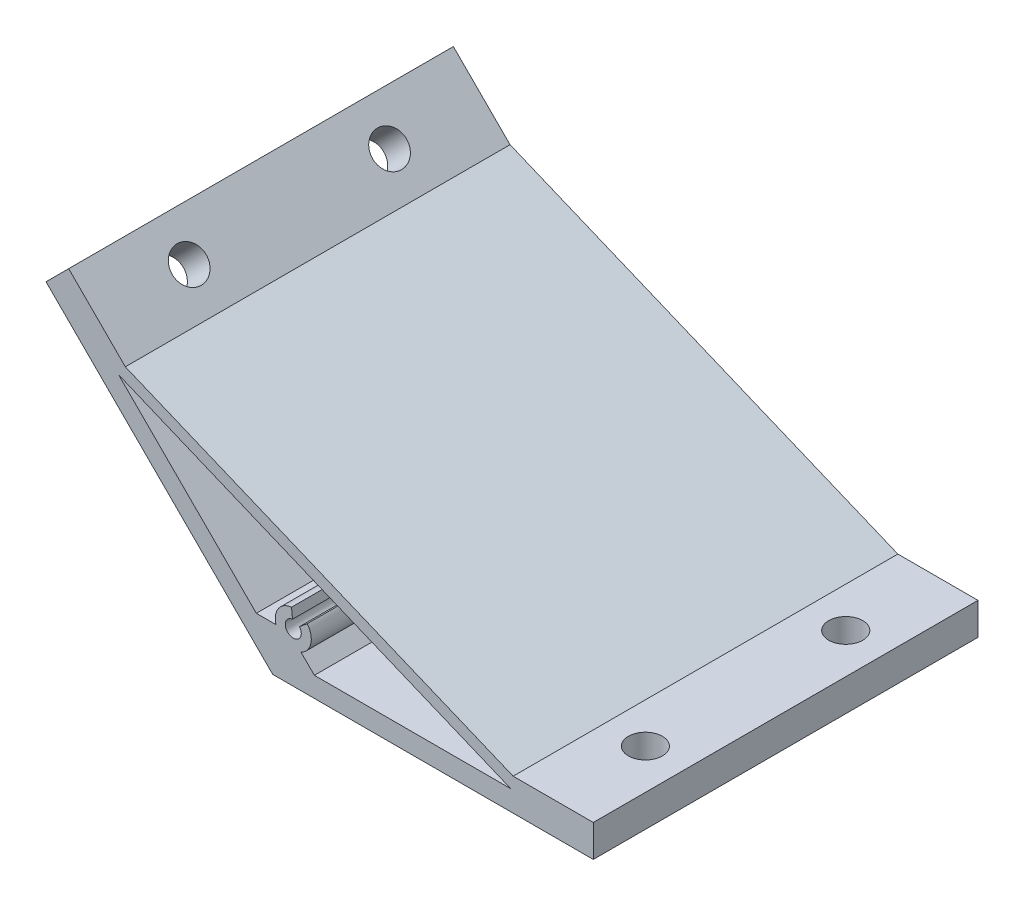
ISO-10303-21;
HEADER;
FILE_DESCRIPTION(('STEP AP214'),'2;1');
FILE_NAME('part.step','',(''),(''),'','','');
FILE_SCHEMA(('AUTOMOTIVE_DESIGN { 1 0 10303 214 1 1 1 1 }'));
ENDSEC;
DATA;
#1=APPLICATION_CONTEXT('core data for automotive mechanical design processes');
#2=APPLICATION_PROTOCOL_DEFINITION('international standard','automotive_design',2000,#1);
#3=PRODUCT_CONTEXT('',#1,'mechanical');
#4=PRODUCT('Part','Part','',(#3));
#5=PRODUCT_RELATED_PRODUCT_CATEGORY('part','',(#4));
#6=PRODUCT_DEFINITION_FORMATION('','',#4);
#7=PRODUCT_DEFINITION_CONTEXT('part definition',#1,'design');
#8=PRODUCT_DEFINITION('design','',#6,#7);
#9=PRODUCT_DEFINITION_SHAPE('','',#8);
#10=(LENGTH_UNIT() NAMED_UNIT(*) SI_UNIT(.MILLI.,.METRE.));
#11=(NAMED_UNIT(*) PLANE_ANGLE_UNIT() SI_UNIT($,.RADIAN.));
#12=(NAMED_UNIT(*) SI_UNIT($,.STERADIAN.) SOLID_ANGLE_UNIT());
#13=UNCERTAINTY_MEASURE_WITH_UNIT(LENGTH_MEASURE(1.E-05),#10,'distance_accuracy_value','');
#14=(GEOMETRIC_REPRESENTATION_CONTEXT(3) GLOBAL_UNCERTAINTY_ASSIGNED_CONTEXT((#13)) GLOBAL_UNIT_ASSIGNED_CONTEXT((#10,
#11,#12)) REPRESENTATION_CONTEXT('',''));
#15=CARTESIAN_POINT('',(0.,0.,0.));
#16=DIRECTION('',(0.,0.,1.));
#17=DIRECTION('',(1.,0.,0.));
#18=AXIS2_PLACEMENT_3D('',#15,#16,#17);
#19=CARTESIAN_POINT('',(580.06230191566,1400.39427630612,48.));
#20=DIRECTION('',(0.382683432365095,0.923879532511284,0.));
#21=DIRECTION('',(-0.923879532511285,0.382683432365095,0.));
#22=AXIS2_PLACEMENT_3D('',#19,#20,#21);
#23=PLANE('',#22);
#24=DIRECTION('',(0.923879532511285,-0.382683432365095,0.));
#25=VECTOR('',#24,1.);
#26=CARTESIAN_POINT('',(580.06230191566,1400.39427630612,-48.));
#27=LINE('',#26,#25);
#28=CARTESIAN_POINT('',(6955.91811216156,-1240.57167203307,-48.));
#29=VERTEX_POINT('',#28);
#30=CARTESIAN_POINT('',(7052.68766478326,-1280.65493315376,-48.));
#31=VERTEX_POINT('',#30);
#32=EDGE_CURVE('E236',#29,#31,#27,.T.);
#33=ORIENTED_EDGE('',*,*,#32,.F.);
#34=DIRECTION('',(0.,0.,-1.));
#35=VECTOR('',#34,1.);
#36=CARTESIAN_POINT('',(6955.91811216156,-1240.57167203307,48.));
#37=LINE('',#36,#35);
#38=CARTESIAN_POINT('',(6955.91811216156,-1240.57167203307,48.));
#39=VERTEX_POINT('',#38);
#40=EDGE_CURVE('E11',#39,#29,#37,.T.);
#41=ORIENTED_EDGE('',*,*,#40,.F.);
#42=DIRECTION('',(0.923879532511285,-0.382683432365095,0.));
#43=VECTOR('',#42,1.);
#44=CARTESIAN_POINT('',(580.06230191566,1400.39427630612,48.));
#45=LINE('',#44,#43);
#46=CARTESIAN_POINT('',(7052.68766478326,-1280.65493315376,48.));
#47=VERTEX_POINT('',#46);
#48=EDGE_CURVE('E272',#39,#47,#45,.T.);
#49=ORIENTED_EDGE('',*,*,#48,.T.);
#50=DIRECTION('',(0.,0.,-1.));
#51=VECTOR('',#50,1.);
#52=CARTESIAN_POINT('',(7052.68766478326,-1280.65493315376,48.));
#53=LINE('',#52,#51);
#54=EDGE_CURVE('E54',#47,#31,#53,.T.);
#55=ORIENTED_EDGE('',*,*,#54,.T.);
#56=EDGE_LOOP('',(#33,#41,#49,#55));
#57=FACE_BOUND('',#56,.T.);
#58=ADVANCED_FACE('F35',(#57),#23,.T.);
#59=CARTESIAN_POINT('',(2857.67322006435,2857.67322006426,48.));
#60=DIRECTION('',(-0.707106781186559,-0.707106781186536,0.));
#61=DIRECTION('',(0.707106781186536,-0.707106781186559,0.));
#62=AXIS2_PLACEMENT_3D('',#59,#60,#61);
#63=PLANE('',#62);
#64=CARTESIAN_POINT('',(6948.84704434969,-1233.50060422121,-25.));
#65=DIRECTION('',(-0.707106781186559,-0.707106781186536,0.));
#66=DIRECTION('',(0.707106781186536,-0.707106781186559,0.));
#67=AXIS2_PLACEMENT_3D('',#64,#65,#66);
#68=CIRCLE('',#67,4.24999999999998);
#69=CARTESIAN_POINT('',(6951.85224816974,-1236.50580804125,-25.));
#70=VERTEX_POINT('',#69);
#71=EDGE_CURVE('E301',#70,#70,#68,.T.);
#72=ORIENTED_EDGE('',*,*,#71,.T.);
#73=EDGE_LOOP('',(#72));
#74=FACE_BOUND('',#73,.T.);
#75=CARTESIAN_POINT('',(6948.84704434969,-1233.50060422121,25.));
#76=DIRECTION('',(-0.707106781186559,-0.707106781186536,0.));
#77=DIRECTION('',(0.707106781186536,-0.707106781186559,0.));
#78=AXIS2_PLACEMENT_3D('',#75,#76,#77);
#79=CIRCLE('',#78,4.24999999999998);
#80=CARTESIAN_POINT('',(6951.85224816974,-1236.50580804125,25.));
#81=VERTEX_POINT('',#80);
#82=EDGE_CURVE('E264',#81,#81,#79,.T.);
#83=ORIENTED_EDGE('',*,*,#82,.T.);
#84=EDGE_LOOP('',(#83));
#85=FACE_BOUND('',#84,.T.);
#86=DIRECTION('',(-0.707106781186536,0.707106781186559,0.));
#87=VECTOR('',#86,1.);
#88=CARTESIAN_POINT('',(2857.67322006435,2857.67322006426,-48.));
#89=LINE('',#88,#87);
#90=CARTESIAN_POINT('',(6941.77597653783,-1226.42953640934,-48.));
#91=VERTEX_POINT('',#90);
#92=EDGE_CURVE('E233',#29,#91,#89,.T.);
#93=ORIENTED_EDGE('',*,*,#92,.T.);
#94=DIRECTION('',(0.,0.,-1.));
#95=VECTOR('',#94,1.);
#96=CARTESIAN_POINT('',(6941.77597653783,-1226.42953640934,48.));
#97=LINE('',#96,#95);
#98=CARTESIAN_POINT('',(6941.77597653783,-1226.42953640934,48.));
#99=VERTEX_POINT('',#98);
#100=EDGE_CURVE('E45',#99,#91,#97,.T.);
#101=ORIENTED_EDGE('',*,*,#100,.F.);
#102=DIRECTION('',(-0.707106781186536,0.707106781186559,0.));
#103=VECTOR('',#102,1.);
#104=CARTESIAN_POINT('',(2857.67322006435,2857.67322006426,48.));
#105=LINE('',#104,#103);
#106=EDGE_CURVE('E270',#39,#99,#105,.T.);
#107=ORIENTED_EDGE('',*,*,#106,.F.);
#108=ORIENTED_EDGE('',*,*,#40,.T.);
#109=EDGE_LOOP('',(#93,#101,#107,#108));
#110=FACE_BOUND('',#109,.T.);
#111=ADVANCED_FACE('F343',(#74,#85,#110),#63,.F.);
#112=CARTESIAN_POINT('',(4084.10275647372,-4084.10275647356,48.));
#113=DIRECTION('',(-0.707106781186561,0.707106781186534,0.));
#114=DIRECTION('',(-0.707106781186534,-0.707106781186561,0.));
#115=AXIS2_PLACEMENT_3D('',#112,#113,#114);
#116=PLANE('',#115);
#117=DIRECTION('',(0.707106781186534,0.707106781186561,0.));
#118=VECTOR('',#117,1.);
#119=CARTESIAN_POINT('',(4084.10275647372,-4084.10275647356,-48.));
#120=LINE('',#119,#118);
#121=CARTESIAN_POINT('',(6936.11912228834,-1232.08639065884,-48.));
#122=VERTEX_POINT('',#121);
#123=EDGE_CURVE('E230',#122,#91,#120,.T.);
#124=ORIENTED_EDGE('',*,*,#123,.F.);
#125=DIRECTION('',(0.,0.,-1.));
#126=VECTOR('',#125,1.);
#127=CARTESIAN_POINT('',(6936.11912228834,-1232.08639065884,48.));
#128=LINE('',#127,#126);
#129=CARTESIAN_POINT('',(6936.11912228834,-1232.08639065884,48.));
#130=VERTEX_POINT('',#129);
#131=EDGE_CURVE('E186',#130,#122,#128,.T.);
#132=ORIENTED_EDGE('',*,*,#131,.F.);
#133=DIRECTION('',(0.707106781186534,0.707106781186561,0.));
#134=VECTOR('',#133,1.);
#135=CARTESIAN_POINT('',(4084.10275647372,-4084.10275647356,48.));
#136=LINE('',#135,#134);
#137=EDGE_CURVE('E267',#130,#99,#136,.T.);
#138=ORIENTED_EDGE('',*,*,#137,.T.);
#139=ORIENTED_EDGE('',*,*,#100,.T.);
#140=EDGE_LOOP('',(#124,#132,#138,#139));
#141=FACE_BOUND('',#140,.T.);
#142=ADVANCED_FACE('F348',(#141),#116,.T.);
#143=CARTESIAN_POINT('',(2852.0163658146,2852.01636581472,48.));
#144=DIRECTION('',(-0.707106781186532,-0.707106781186563,0.));
#145=DIRECTION('',(0.707106781186563,-0.707106781186532,0.));
#146=AXIS2_PLACEMENT_3D('',#143,#144,#145);
#147=PLANE('',#146);
#148=CARTESIAN_POINT('',(6943.1901901002,-1239.1574584707,-25.));
#149=DIRECTION('',(-0.707106781186532,-0.707106781186563,0.));
#150=DIRECTION('',(0.707106781186563,-0.707106781186532,0.));
#151=AXIS2_PLACEMENT_3D('',#148,#149,#150);
#152=CIRCLE('',#151,4.24999999999999);
#153=CARTESIAN_POINT('',(6946.19539392024,-1242.16266229074,-25.));
#154=VERTEX_POINT('',#153);
#155=EDGE_CURVE('E304',#154,#154,#152,.T.);
#156=ORIENTED_EDGE('',*,*,#155,.F.);
#157=EDGE_LOOP('',(#156));
#158=FACE_BOUND('',#157,.T.);
#159=CARTESIAN_POINT('',(6943.1901901002,-1239.1574584707,25.));
#160=DIRECTION('',(-0.707106781186532,-0.707106781186563,0.));
#161=DIRECTION('',(0.707106781186563,-0.707106781186532,0.));
#162=AXIS2_PLACEMENT_3D('',#159,#160,#161);
#163=CIRCLE('',#162,4.24999999999999);
#164=CARTESIAN_POINT('',(6946.19539392024,-1242.16266229074,25.));
#165=VERTEX_POINT('',#164);
#166=EDGE_CURVE('E298',#165,#165,#163,.T.);
#167=ORIENTED_EDGE('',*,*,#166,.F.);
#168=EDGE_LOOP('',(#167));
#169=FACE_BOUND('',#168,.T.);
#170=DIRECTION('',(-0.707106781186563,0.707106781186532,0.));
#171=VECTOR('',#170,1.);
#172=CARTESIAN_POINT('',(2852.0163658146,2852.01636581472,-48.));
#173=LINE('',#172,#171);
#174=CARTESIAN_POINT('',(6992.68766478326,-1288.65493315376,-48.));
#175=VERTEX_POINT('',#174);
#176=EDGE_CURVE('E227',#175,#122,#173,.T.);
#177=ORIENTED_EDGE('',*,*,#176,.F.);
#178=DIRECTION('',(0.,0.,-1.));
#179=VECTOR('',#178,1.);
#180=CARTESIAN_POINT('',(6992.68766478326,-1288.65493315376,48.));
#181=LINE('',#180,#179);
#182=CARTESIAN_POINT('',(6992.68766478326,-1288.65493315376,48.));
#183=VERTEX_POINT('',#182);
#184=EDGE_CURVE('E184',#183,#175,#181,.T.);
#185=ORIENTED_EDGE('',*,*,#184,.F.);
#186=DIRECTION('',(-0.707106781186563,0.707106781186532,0.));
#187=VECTOR('',#186,1.);
#188=CARTESIAN_POINT('',(2852.0163658146,2852.01636581472,48.));
#189=LINE('',#188,#187);
#190=EDGE_CURVE('E178',#183,#130,#189,.T.);
#191=ORIENTED_EDGE('',*,*,#190,.T.);
#192=ORIENTED_EDGE('',*,*,#131,.T.);
#193=EDGE_LOOP('',(#177,#185,#191,#192));
#194=FACE_BOUND('',#193,.T.);
#195=ADVANCED_FACE('F324',(#158,#169,#194),#147,.T.);
#196=CARTESIAN_POINT('',(0.,-1288.65493315376,48.));
#197=DIRECTION('',(0.,1.,0.));
#198=DIRECTION('',(0.,0.,1.));
#199=AXIS2_PLACEMENT_3D('',#196,#197,#198);
#200=PLANE('',#199);
#201=CARTESIAN_POINT('',(7062.68766478327,-1288.65493315377,-25.));
#202=DIRECTION('',(0.,-1.,0.));
#203=DIRECTION('',(0.,0.,-1.));
#204=AXIS2_PLACEMENT_3D('',#201,#202,#203);
#205=CIRCLE('',#204,4.24999999999986);
#206=CARTESIAN_POINT('',(7062.68766478327,-1288.65493315377,-29.2499999999999));
#207=VERTEX_POINT('',#206);
#208=EDGE_CURVE('E316',#207,#207,#205,.T.);
#209=ORIENTED_EDGE('',*,*,#208,.F.);
#210=EDGE_LOOP('',(#209));
#211=FACE_BOUND('',#210,.T.);
#212=CARTESIAN_POINT('',(7062.68766478327,-1288.65493315377,25.));
#213=DIRECTION('',(0.,-1.,0.));
#214=DIRECTION('',(0.,0.,-1.));
#215=AXIS2_PLACEMENT_3D('',#212,#213,#214);
#216=CIRCLE('',#215,4.24999999999986);
#217=CARTESIAN_POINT('',(7062.68766478327,-1288.65493315377,20.7500000000001));
#218=VERTEX_POINT('',#217);
#219=EDGE_CURVE('E310',#218,#218,#216,.T.);
#220=ORIENTED_EDGE('',*,*,#219,.F.);
#221=EDGE_LOOP('',(#220));
#222=FACE_BOUND('',#221,.T.);
#223=DIRECTION('',(1.,0.,0.));
#224=VECTOR('',#223,1.);
#225=CARTESIAN_POINT('',(0.,-1288.65493315376,-48.));
#226=LINE('',#225,#224);
#227=CARTESIAN_POINT('',(7072.68766478326,-1288.65493315376,-48.));
#228=VERTEX_POINT('',#227);
#229=EDGE_CURVE('E183',#175,#228,#226,.T.);
#230=ORIENTED_EDGE('',*,*,#229,.T.);
#231=DIRECTION('',(0.,0.,-1.));
#232=VECTOR('',#231,1.);
#233=CARTESIAN_POINT('',(7072.68766478326,-1288.65493315376,48.));
#234=LINE('',#233,#232);
#235=CARTESIAN_POINT('',(7072.68766478326,-1288.65493315376,48.));
#236=VERTEX_POINT('',#235);
#237=EDGE_CURVE('E165',#236,#228,#234,.T.);
#238=ORIENTED_EDGE('',*,*,#237,.F.);
#239=DIRECTION('',(1.,0.,0.));
#240=VECTOR('',#239,1.);
#241=CARTESIAN_POINT('',(0.,-1288.65493315376,48.));
#242=LINE('',#241,#240);
#243=EDGE_CURVE('E170',#183,#236,#242,.T.);
#244=ORIENTED_EDGE('',*,*,#243,.F.);
#245=ORIENTED_EDGE('',*,*,#184,.T.);
#246=EDGE_LOOP('',(#230,#238,#244,#245));
#247=FACE_BOUND('',#246,.T.);
#248=ADVANCED_FACE('F181',(#211,#222,#247),#200,.F.);
#249=CARTESIAN_POINT('',(7072.68766478326,0.,48.));
#250=DIRECTION('',(-1.,0.,0.));
#251=DIRECTION('',(0.,0.,1.));
#252=AXIS2_PLACEMENT_3D('',#249,#250,#251);
#253=PLANE('',#252);
#254=DIRECTION('',(0.,1.,0.));
#255=VECTOR('',#254,1.);
#256=CARTESIAN_POINT('',(7072.68766478326,0.,-48.));
#257=LINE('',#256,#255);
#258=CARTESIAN_POINT('',(7072.68766478326,-1280.65493315376,-48.));
#259=VERTEX_POINT('',#258);
#260=EDGE_CURVE('E224',#228,#259,#257,.T.);
#261=ORIENTED_EDGE('',*,*,#260,.T.);
#262=DIRECTION('',(0.,0.,-1.));
#263=VECTOR('',#262,1.);
#264=CARTESIAN_POINT('',(7072.68766478326,-1280.65493315376,48.));
#265=LINE('',#264,#263);
#266=CARTESIAN_POINT('',(7072.68766478326,-1280.65493315376,48.));
#267=VERTEX_POINT('',#266);
#268=EDGE_CURVE('E107',#267,#259,#265,.T.);
#269=ORIENTED_EDGE('',*,*,#268,.F.);
#270=DIRECTION('',(0.,1.,0.));
#271=VECTOR('',#270,1.);
#272=CARTESIAN_POINT('',(7072.68766478326,0.,48.));
#273=LINE('',#272,#271);
#274=EDGE_CURVE('E161',#236,#267,#273,.T.);
#275=ORIENTED_EDGE('',*,*,#274,.F.);
#276=ORIENTED_EDGE('',*,*,#237,.T.);
#277=EDGE_LOOP('',(#261,#269,#275,#276));
#278=FACE_BOUND('',#277,.T.);
#279=ADVANCED_FACE('F163',(#278),#253,.F.);
#280=CARTESIAN_POINT('',(6997.82073881189,-1276.26412007604,48.));
#281=DIRECTION('',(0.,0.,-1.));
#282=DIRECTION('',(-1.,0.,0.));
#283=AXIS2_PLACEMENT_3D('',#280,#281,#282);
#284=CYLINDRICAL_SURFACE('',#283,1.99999999999993);
#285=CARTESIAN_POINT('',(6997.82073881189,-1276.26412007604,-48.));
#286=DIRECTION('',(0.,0.,1.));
#287=DIRECTION('',(1.,0.,0.));
#288=AXIS2_PLACEMENT_3D('',#285,#286,#287);
#289=CIRCLE('',#288,1.99999999999993);
#290=CARTESIAN_POINT('',(6997.62653003943,-1274.27357167103,-48.));
#291=VERTEX_POINT('',#290);
#292=CARTESIAN_POINT('',(6999.36559542733,-1274.99391614055,-48.));
#293=VERTEX_POINT('',#292);
#294=EDGE_CURVE('E261',#291,#293,#289,.T.);
#295=ORIENTED_EDGE('',*,*,#294,.F.);
#296=DIRECTION('',(0.,0.,-1.));
#297=VECTOR('',#296,1.);
#298=CARTESIAN_POINT('',(6997.62653003943,-1274.27357167103,48.));
#299=LINE('',#298,#297);
#300=CARTESIAN_POINT('',(6997.62653003943,-1274.27357167103,48.));
#301=VERTEX_POINT('',#300);
#302=EDGE_CURVE('E39',#301,#291,#299,.T.);
#303=ORIENTED_EDGE('',*,*,#302,.F.);
#304=CARTESIAN_POINT('',(6997.82073881189,-1276.26412007604,48.));
#305=DIRECTION('',(0.,0.,1.));
#306=DIRECTION('',(1.,0.,0.));
#307=AXIS2_PLACEMENT_3D('',#304,#305,#306);
#308=CIRCLE('',#307,1.99999999999993);
#309=CARTESIAN_POINT('',(6999.36559542733,-1274.99391614055,48.));
#310=VERTEX_POINT('',#309);
#311=EDGE_CURVE('E223',#301,#310,#308,.T.);
#312=ORIENTED_EDGE('',*,*,#311,.T.);
#313=DIRECTION('',(0.,0.,-1.));
#314=VECTOR('',#313,1.);
#315=CARTESIAN_POINT('',(6999.36559542733,-1274.99391614055,48.));
#316=LINE('',#315,#314);
#317=EDGE_CURVE('E193',#310,#293,#316,.T.);
#318=ORIENTED_EDGE('',*,*,#317,.T.);
#319=EDGE_LOOP('',(#295,#303,#312,#318));
#320=FACE_BOUND('',#319,.T.);
#321=ADVANCED_FACE('F37',(#320),#284,.F.);
#322=CARTESIAN_POINT('',(6808.49128288336,664.273589646761,48.));
#323=DIRECTION('',(-0.9952742025064,-0.0971043862307417,0.));
#324=DIRECTION('',(0.0971043862307417,-0.9952742025064,0.));
#325=AXIS2_PLACEMENT_3D('',#322,#323,#324);
#326=PLANE('',#325);
#327=DIRECTION('',(-0.0971043862307417,0.9952742025064,0.));
#328=VECTOR('',#327,1.);
#329=CARTESIAN_POINT('',(6808.49128288336,664.273589646761,-48.));
#330=LINE('',#329,#328);
#331=CARTESIAN_POINT('',(6997.38376907385,-1271.78538616476,-48.));
#332=VERTEX_POINT('',#331);
#333=EDGE_CURVE('E259',#291,#332,#330,.T.);
#334=ORIENTED_EDGE('',*,*,#333,.T.);
#335=DIRECTION('',(0.,0.,-1.));
#336=VECTOR('',#335,1.);
#337=CARTESIAN_POINT('',(6997.38376907385,-1271.78538616476,48.));
#338=LINE('',#337,#336);
#339=CARTESIAN_POINT('',(6997.38376907385,-1271.78538616476,48.));
#340=VERTEX_POINT('',#339);
#341=EDGE_CURVE('E210',#340,#332,#338,.T.);
#342=ORIENTED_EDGE('',*,*,#341,.F.);
#343=DIRECTION('',(-0.0971043862307417,0.9952742025064,0.));
#344=VECTOR('',#343,1.);
#345=CARTESIAN_POINT('',(6808.49128288336,664.273589646761,48.));
#346=LINE('',#345,#344);
#347=EDGE_CURVE('E293',#301,#340,#346,.T.);
#348=ORIENTED_EDGE('',*,*,#347,.F.);
#349=ORIENTED_EDGE('',*,*,#302,.T.);
#350=EDGE_LOOP('',(#334,#342,#348,#349));
#351=FACE_BOUND('',#350,.T.);
#352=ADVANCED_FACE('F384',(#351),#326,.F.);
#353=CARTESIAN_POINT('',(6997.82073881189,-1276.26412007604,48.));
#354=DIRECTION('',(0.,0.,-1.));
#355=DIRECTION('',(-1.,0.,0.));
#356=AXIS2_PLACEMENT_3D('',#353,#354,#355);
#357=CYLINDRICAL_SURFACE('',#356,4.49999999999951);
#358=CARTESIAN_POINT('',(6997.82073881189,-1276.26412007604,-48.));
#359=DIRECTION('',(0.,0.,1.));
#360=DIRECTION('',(1.,0.,0.));
#361=AXIS2_PLACEMENT_3D('',#358,#359,#360);
#362=CIRCLE('',#361,4.49999999999951);
#363=CARTESIAN_POINT('',(6993.49338103034,-1277.49861374974,-48.));
#364=VERTEX_POINT('',#363);
#365=EDGE_CURVE('E257',#332,#364,#362,.T.);
#366=ORIENTED_EDGE('',*,*,#365,.T.);
#367=DIRECTION('',(0.,0.,-1.));
#368=VECTOR('',#367,1.);
#369=CARTESIAN_POINT('',(6993.49338103034,-1277.49861374974,48.));
#370=LINE('',#369,#368);
#371=CARTESIAN_POINT('',(6993.49338103034,-1277.49861374974,48.));
#372=VERTEX_POINT('',#371);
#373=EDGE_CURVE('E209',#372,#364,#370,.T.);
#374=ORIENTED_EDGE('',*,*,#373,.F.);
#375=CARTESIAN_POINT('',(6997.82073881189,-1276.26412007604,48.));
#376=DIRECTION('',(0.,0.,1.));
#377=DIRECTION('',(1.,0.,0.));
#378=AXIS2_PLACEMENT_3D('',#375,#376,#377);
#379=CIRCLE('',#378,4.49999999999951);
#380=EDGE_CURVE('E291',#340,#372,#379,.T.);
#381=ORIENTED_EDGE('',*,*,#380,.F.);
#382=ORIENTED_EDGE('',*,*,#341,.T.);
#383=EDGE_LOOP('',(#366,#374,#381,#382));
#384=FACE_BOUND('',#383,.T.);
#385=ADVANCED_FACE('F381',(#384),#357,.T.);
#386=CARTESIAN_POINT('',(1.15994087185971E-09,-1277.49861375609,48.));
#387=DIRECTION('',(-9.079781843749E-13,1.,0.));
#388=DIRECTION('',(-1.,-9.079781843749E-13,0.));
#389=AXIS2_PLACEMENT_3D('',#386,#387,#388);
#390=PLANE('',#389);
#391=DIRECTION('',(1.,9.079781843749E-13,0.));
#392=VECTOR('',#391,1.);
#393=CARTESIAN_POINT('',(1.15994087185971E-09,-1277.49861375609,-48.));
#394=LINE('',#393,#392);
#395=CARTESIAN_POINT('',(6988.60241319111,-1277.49861374974,-48.));
#396=VERTEX_POINT('',#395);
#397=EDGE_CURVE('E254',#396,#364,#394,.T.);
#398=ORIENTED_EDGE('',*,*,#397,.F.);
#399=DIRECTION('',(0.,0.,-1.));
#400=VECTOR('',#399,1.);
#401=CARTESIAN_POINT('',(6988.60241319111,-1277.49861374974,48.));
#402=LINE('',#401,#400);
#403=CARTESIAN_POINT('',(6988.60241319111,-1277.49861374974,48.));
#404=VERTEX_POINT('',#403);
#405=EDGE_CURVE('E207',#404,#396,#402,.T.);
#406=ORIENTED_EDGE('',*,*,#405,.F.);
#407=DIRECTION('',(1.,9.079781843749E-13,0.));
#408=VECTOR('',#407,1.);
#409=CARTESIAN_POINT('',(1.15994087185971E-09,-1277.49861375609,48.));
#410=LINE('',#409,#408);
#411=EDGE_CURVE('E288',#404,#372,#410,.T.);
#412=ORIENTED_EDGE('',*,*,#411,.T.);
#413=ORIENTED_EDGE('',*,*,#373,.T.);
#414=EDGE_LOOP('',(#398,#406,#412,#413));
#415=FACE_BOUND('',#414,.T.);
#416=ADVANCED_FACE('F377',(#415),#390,.T.);
#417=CARTESIAN_POINT('',(2855.55189972073,2855.55189972069,48.));
#418=DIRECTION('',(-0.707106781186552,-0.707106781186543,0.));
#419=DIRECTION('',(0.707106781186543,-0.707106781186552,0.));
#420=AXIS2_PLACEMENT_3D('',#417,#418,#419);
#421=PLANE('',#420);
#422=DIRECTION('',(-0.707106781186543,0.707106781186552,0.));
#423=VECTOR('',#422,1.);
#424=CARTESIAN_POINT('',(2855.55189972073,2855.55189972069,-48.));
#425=LINE('',#424,#423);
#426=CARTESIAN_POINT('',(6954.21874866951,-1243.11494922814,-48.));
#427=VERTEX_POINT('',#426);
#428=EDGE_CURVE('E252',#396,#427,#425,.T.);
#429=ORIENTED_EDGE('',*,*,#428,.T.);
#430=DIRECTION('',(0.,0.,-1.));
#431=VECTOR('',#430,1.);
#432=CARTESIAN_POINT('',(6954.21874866951,-1243.11494922814,48.));
#433=LINE('',#432,#431);
#434=CARTESIAN_POINT('',(6954.21874866951,-1243.11494922814,48.));
#435=VERTEX_POINT('',#434);
#436=EDGE_CURVE('E204',#435,#427,#433,.T.);
#437=ORIENTED_EDGE('',*,*,#436,.F.);
#438=DIRECTION('',(-0.707106781186543,0.707106781186552,0.));
#439=VECTOR('',#438,1.);
#440=CARTESIAN_POINT('',(2855.55189972073,2855.55189972069,48.));
#441=LINE('',#440,#439);
#442=EDGE_CURVE('E286',#404,#435,#441,.T.);
#443=ORIENTED_EDGE('',*,*,#442,.F.);
#444=ORIENTED_EDGE('',*,*,#405,.T.);
#445=EDGE_LOOP('',(#429,#437,#443,#444));
#446=FACE_BOUND('',#445,.T.);
#447=ADVANCED_FACE('F373',(#446),#421,.F.);
#448=CARTESIAN_POINT('',(578.914251618586,1397.62263770862,48.));
#449=DIRECTION('',(0.3826834323651,0.923879532511283,0.));
#450=DIRECTION('',(-0.923879532511283,0.3826834323651,0.));
#451=AXIS2_PLACEMENT_3D('',#448,#449,#450);
#452=PLANE('',#451);
#453=DIRECTION('',(0.923879532511283,-0.3826834323651,0.));
#454=VECTOR('',#453,1.);
#455=CARTESIAN_POINT('',(578.914251618586,1397.62263770862,-48.));
#456=LINE('',#455,#454);
#457=CARTESIAN_POINT('',(7052.09092768112,-1283.65493315376,-48.));
#458=VERTEX_POINT('',#457);
#459=EDGE_CURVE('E249',#427,#458,#456,.T.);
#460=ORIENTED_EDGE('',*,*,#459,.T.);
#461=DIRECTION('',(0.,0.,-1.));
#462=VECTOR('',#461,1.);
#463=CARTESIAN_POINT('',(7052.09092768112,-1283.65493315376,48.));
#464=LINE('',#463,#462);
#465=CARTESIAN_POINT('',(7052.09092768112,-1283.65493315376,48.));
#466=VERTEX_POINT('',#465);
#467=EDGE_CURVE('E202',#466,#458,#464,.T.);
#468=ORIENTED_EDGE('',*,*,#467,.F.);
#469=DIRECTION('',(0.923879532511283,-0.3826834323651,0.));
#470=VECTOR('',#469,1.);
#471=CARTESIAN_POINT('',(578.914251618586,1397.62263770862,48.));
#472=LINE('',#471,#470);
#473=EDGE_CURVE('E284',#435,#466,#472,.T.);
#474=ORIENTED_EDGE('',*,*,#473,.F.);
#475=ORIENTED_EDGE('',*,*,#436,.T.);
#476=EDGE_LOOP('',(#460,#468,#474,#475));
#477=FACE_BOUND('',#476,.T.);
#478=ADVANCED_FACE('F369',(#477),#452,.F.);
#479=CARTESIAN_POINT('',(-5.8169112753506E-12,-1283.65493315373,48.));
#480=DIRECTION('',(0.,1.,0.));
#481=DIRECTION('',(-1.,0.,0.));
#482=AXIS2_PLACEMENT_3D('',#479,#480,#481);
#483=PLANE('',#482);
#484=DIRECTION('',(1.,0.,0.));
#485=VECTOR('',#484,1.);
#486=CARTESIAN_POINT('',(-5.8169112753506E-12,-1283.65493315373,-48.));
#487=LINE('',#486,#485);
#488=CARTESIAN_POINT('',(7003.09092768112,-1283.65493315376,-48.));
#489=VERTEX_POINT('',#488);
#490=EDGE_CURVE('E246',#489,#458,#487,.T.);
#491=ORIENTED_EDGE('',*,*,#490,.F.);
#492=DIRECTION('',(0.,0.,-1.));
#493=VECTOR('',#492,1.);
#494=CARTESIAN_POINT('',(7003.09092768112,-1283.65493315376,48.));
#495=LINE('',#494,#493);
#496=CARTESIAN_POINT('',(7003.09092768112,-1283.65493315376,48.));
#497=VERTEX_POINT('',#496);
#498=EDGE_CURVE('E200',#497,#489,#495,.T.);
#499=ORIENTED_EDGE('',*,*,#498,.F.);
#500=DIRECTION('',(1.,0.,0.));
#501=VECTOR('',#500,1.);
#502=CARTESIAN_POINT('',(-5.8169112753506E-12,-1283.65493315373,48.));
#503=LINE('',#502,#501);
#504=EDGE_CURVE('E281',#497,#466,#503,.T.);
#505=ORIENTED_EDGE('',*,*,#504,.T.);
#506=ORIENTED_EDGE('',*,*,#467,.T.);
#507=EDGE_LOOP('',(#491,#499,#505,#506));
#508=FACE_BOUND('',#507,.T.);
#509=ADVANCED_FACE('F365',(#508),#483,.T.);
#510=CARTESIAN_POINT('',(2859.71799726508,2859.71799726394,48.));
#511=DIRECTION('',(-0.707106781186689,-0.707106781186406,0.));
#512=DIRECTION('',(0.707106781186406,-0.707106781186689,0.));
#513=AXIS2_PLACEMENT_3D('',#510,#511,#512);
#514=PLANE('',#513);
#515=DIRECTION('',(-0.707106781186406,0.707106781186689,0.));
#516=VECTOR('',#515,1.);
#517=CARTESIAN_POINT('',(2859.71799726508,2859.71799726394,-48.));
#518=LINE('',#517,#516);
#519=CARTESIAN_POINT('',(6999.76054974539,-1280.32455521803,-48.));
#520=VERTEX_POINT('',#519);
#521=EDGE_CURVE('E244',#489,#520,#518,.T.);
#522=ORIENTED_EDGE('',*,*,#521,.T.);
#523=DIRECTION('',(0.,0.,-1.));
#524=VECTOR('',#523,1.);
#525=CARTESIAN_POINT('',(6999.76054974539,-1280.32455521803,48.));
#526=LINE('',#525,#524);
#527=CARTESIAN_POINT('',(6999.76054974539,-1280.32455521803,48.));
#528=VERTEX_POINT('',#527);
#529=EDGE_CURVE('E197',#528,#520,#526,.T.);
#530=ORIENTED_EDGE('',*,*,#529,.F.);
#531=DIRECTION('',(-0.707106781186406,0.707106781186689,0.));
#532=VECTOR('',#531,1.);
#533=CARTESIAN_POINT('',(2859.71799726508,2859.71799726394,48.));
#534=LINE('',#533,#532);
#535=EDGE_CURVE('E279',#497,#528,#534,.T.);
#536=ORIENTED_EDGE('',*,*,#535,.F.);
#537=ORIENTED_EDGE('',*,*,#498,.T.);
#538=EDGE_LOOP('',(#522,#530,#536,#537));
#539=FACE_BOUND('',#538,.T.);
#540=ADVANCED_FACE('F361',(#539),#514,.F.);
#541=CARTESIAN_POINT('',(6997.82073881189,-1276.26412007604,48.));
#542=DIRECTION('',(0.,0.,-1.));
#543=DIRECTION('',(-1.,0.,0.));
#544=AXIS2_PLACEMENT_3D('',#541,#542,#543);
#545=CYLINDRICAL_SURFACE('',#544,4.50000000000019);
#546=CARTESIAN_POINT('',(6997.82073881189,-1276.26412007604,-48.));
#547=DIRECTION('',(0.,0.,1.));
#548=DIRECTION('',(1.,0.,0.));
#549=AXIS2_PLACEMENT_3D('',#546,#547,#548);
#550=CIRCLE('',#549,4.50000000000019);
#551=CARTESIAN_POINT('',(7001.29666619663,-1273.40616122119,-48.));
#552=VERTEX_POINT('',#551);
#553=EDGE_CURVE('E241',#520,#552,#550,.T.);
#554=ORIENTED_EDGE('',*,*,#553,.T.);
#555=DIRECTION('',(0.,0.,-1.));
#556=VECTOR('',#555,1.);
#557=CARTESIAN_POINT('',(7001.29666619663,-1273.40616122119,48.));
#558=LINE('',#557,#556);
#559=CARTESIAN_POINT('',(7001.29666619663,-1273.40616122119,48.));
#560=VERTEX_POINT('',#559);
#561=EDGE_CURVE('E195',#560,#552,#558,.T.);
#562=ORIENTED_EDGE('',*,*,#561,.F.);
#563=CARTESIAN_POINT('',(6997.82073881189,-1276.26412007604,48.));
#564=DIRECTION('',(0.,0.,1.));
#565=DIRECTION('',(1.,0.,0.));
#566=AXIS2_PLACEMENT_3D('',#563,#564,#565);
#567=CIRCLE('',#566,4.50000000000019);
#568=EDGE_CURVE('E277',#528,#560,#567,.T.);
#569=ORIENTED_EDGE('',*,*,#568,.F.);
#570=ORIENTED_EDGE('',*,*,#529,.T.);
#571=EDGE_LOOP('',(#554,#562,#569,#570));
#572=FACE_BOUND('',#571,.T.);
#573=ADVANCED_FACE('F357',(#572),#545,.T.);
#574=CARTESIAN_POINT('',(3448.70038270471,-4194.40331746767,48.));
#575=DIRECTION('',(-0.63510196774562,0.772428307719002,0.));
#576=DIRECTION('',(-0.772428307719002,-0.63510196774562,0.));
#577=AXIS2_PLACEMENT_3D('',#574,#575,#576);
#578=PLANE('',#577);
#579=DIRECTION('',(0.772428307719002,0.63510196774562,0.));
#580=VECTOR('',#579,1.);
#581=CARTESIAN_POINT('',(3448.70038270471,-4194.40331746767,-48.));
#582=LINE('',#581,#580);
#583=EDGE_CURVE('E238',#293,#552,#582,.T.);
#584=ORIENTED_EDGE('',*,*,#583,.F.);
#585=ORIENTED_EDGE('',*,*,#317,.F.);
#586=DIRECTION('',(0.772428307719002,0.63510196774562,0.));
#587=VECTOR('',#586,1.);
#588=CARTESIAN_POINT('',(3448.70038270471,-4194.40331746767,48.));
#589=LINE('',#588,#587);
#590=EDGE_CURVE('E274',#310,#560,#589,.T.);
#591=ORIENTED_EDGE('',*,*,#590,.T.);
#592=ORIENTED_EDGE('',*,*,#561,.T.);
#593=EDGE_LOOP('',(#584,#585,#591,#592));
#594=FACE_BOUND('',#593,.T.);
#595=ADVANCED_FACE('F353',(#594),#578,.T.);
#596=CARTESIAN_POINT('',(0.,-1280.65493315376,48.));
#597=DIRECTION('',(0.,1.,0.));
#598=DIRECTION('',(0.,0.,1.));
#599=AXIS2_PLACEMENT_3D('',#596,#597,#598);
#600=PLANE('',#599);
#601=CARTESIAN_POINT('',(7062.68766478327,-1280.65493315376,-25.));
#602=DIRECTION('',(0.,1.,0.));
#603=DIRECTION('',(0.,0.,1.));
#604=AXIS2_PLACEMENT_3D('',#601,#602,#603);
#605=CIRCLE('',#604,4.24999999999986);
#606=CARTESIAN_POINT('',(7062.68766478327,-1280.65493315376,-20.7500000000001));
#607=VERTEX_POINT('',#606);
#608=EDGE_CURVE('E313',#607,#607,#605,.T.);
#609=ORIENTED_EDGE('',*,*,#608,.F.);
#610=EDGE_LOOP('',(#609));
#611=FACE_BOUND('',#610,.T.);
#612=CARTESIAN_POINT('',(7062.68766478327,-1280.65493315376,25.));
#613=DIRECTION('',(0.,1.,0.));
#614=DIRECTION('',(0.,0.,1.));
#615=AXIS2_PLACEMENT_3D('',#612,#613,#614);
#616=CIRCLE('',#615,4.24999999999986);
#617=CARTESIAN_POINT('',(7062.68766478327,-1280.65493315376,29.2499999999999));
#618=VERTEX_POINT('',#617);
#619=EDGE_CURVE('E307',#618,#618,#616,.T.);
#620=ORIENTED_EDGE('',*,*,#619,.F.);
#621=EDGE_LOOP('',(#620));
#622=FACE_BOUND('',#621,.T.);
#623=DIRECTION('',(1.,0.,0.));
#624=VECTOR('',#623,1.);
#625=CARTESIAN_POINT('',(0.,-1280.65493315376,-48.));
#626=LINE('',#625,#624);
#627=EDGE_CURVE('E220',#31,#259,#626,.T.);
#628=ORIENTED_EDGE('',*,*,#627,.F.);
#629=ORIENTED_EDGE('',*,*,#54,.F.);
#630=DIRECTION('',(1.,0.,0.));
#631=VECTOR('',#630,1.);
#632=CARTESIAN_POINT('',(0.,-1280.65493315376,48.));
#633=LINE('',#632,#631);
#634=EDGE_CURVE('E169',#47,#267,#633,.T.);
#635=ORIENTED_EDGE('',*,*,#634,.T.);
#636=ORIENTED_EDGE('',*,*,#268,.T.);
#637=EDGE_LOOP('',(#628,#629,#635,#636));
#638=FACE_BOUND('',#637,.T.);
#639=ADVANCED_FACE('F356',(#611,#622,#638),#600,.T.);
#640=CARTESIAN_POINT('',(0.,0.,48.));
#641=DIRECTION('',(0.,0.,1.));
#642=DIRECTION('',(1.,0.,0.));
#643=AXIS2_PLACEMENT_3D('',#640,#641,#642);
#644=PLANE('',#643);
#645=ORIENTED_EDGE('',*,*,#311,.F.);
#646=ORIENTED_EDGE('',*,*,#347,.T.);
#647=ORIENTED_EDGE('',*,*,#380,.T.);
#648=ORIENTED_EDGE('',*,*,#411,.F.);
#649=ORIENTED_EDGE('',*,*,#442,.T.);
#650=ORIENTED_EDGE('',*,*,#473,.T.);
#651=ORIENTED_EDGE('',*,*,#504,.F.);
#652=ORIENTED_EDGE('',*,*,#535,.T.);
#653=ORIENTED_EDGE('',*,*,#568,.T.);
#654=ORIENTED_EDGE('',*,*,#590,.F.);
#655=EDGE_LOOP('',(#645,#646,#647,#648,#649,#650,#651,#652,#653,#654));
#656=FACE_BOUND('',#655,.T.);
#657=ORIENTED_EDGE('',*,*,#48,.F.);
#658=ORIENTED_EDGE('',*,*,#106,.T.);
#659=ORIENTED_EDGE('',*,*,#137,.F.);
#660=ORIENTED_EDGE('',*,*,#190,.F.);
#661=ORIENTED_EDGE('',*,*,#243,.T.);
#662=ORIENTED_EDGE('',*,*,#274,.T.);
#663=ORIENTED_EDGE('',*,*,#634,.F.);
#664=EDGE_LOOP('',(#657,#658,#659,#660,#661,#662,#663));
#665=FACE_BOUND('',#664,.T.);
#666=ADVANCED_FACE('F175',(#656,#665),#644,.T.);
#667=CARTESIAN_POINT('',(0.,0.,-48.));
#668=DIRECTION('',(0.,0.,1.));
#669=DIRECTION('',(1.,0.,0.));
#670=AXIS2_PLACEMENT_3D('',#667,#668,#669);
#671=PLANE('',#670);
#672=ORIENTED_EDGE('',*,*,#294,.T.);
#673=ORIENTED_EDGE('',*,*,#583,.T.);
#674=ORIENTED_EDGE('',*,*,#553,.F.);
#675=ORIENTED_EDGE('',*,*,#521,.F.);
#676=ORIENTED_EDGE('',*,*,#490,.T.);
#677=ORIENTED_EDGE('',*,*,#459,.F.);
#678=ORIENTED_EDGE('',*,*,#428,.F.);
#679=ORIENTED_EDGE('',*,*,#397,.T.);
#680=ORIENTED_EDGE('',*,*,#365,.F.);
#681=ORIENTED_EDGE('',*,*,#333,.F.);
#682=EDGE_LOOP('',(#672,#673,#674,#675,#676,#677,#678,#679,#680,#681));
#683=FACE_BOUND('',#682,.T.);
#684=ORIENTED_EDGE('',*,*,#32,.T.);
#685=ORIENTED_EDGE('',*,*,#627,.T.);
#686=ORIENTED_EDGE('',*,*,#260,.F.);
#687=ORIENTED_EDGE('',*,*,#229,.F.);
#688=ORIENTED_EDGE('',*,*,#176,.T.);
#689=ORIENTED_EDGE('',*,*,#123,.T.);
#690=ORIENTED_EDGE('',*,*,#92,.F.);
#691=EDGE_LOOP('',(#684,#685,#686,#687,#688,#689,#690));
#692=FACE_BOUND('',#691,.T.);
#693=ADVANCED_FACE('F390',(#683,#692),#671,.F.);
#694=CARTESIAN_POINT('',(6943.1901901002,-1239.1574584707,25.));
#695=DIRECTION('',(-0.707106781186532,-0.707106781186563,0.));
#696=DIRECTION('',(0.707106781186563,-0.707106781186532,0.));
#697=AXIS2_PLACEMENT_3D('',#694,#695,#696);
#698=CYLINDRICAL_SURFACE('',#697,4.24999999999998);
#699=ORIENTED_EDGE('',*,*,#166,.T.);
#700=EDGE_LOOP('',(#699));
#701=FACE_BOUND('',#700,.T.);
#702=ORIENTED_EDGE('',*,*,#82,.F.);
#703=EDGE_LOOP('',(#702));
#704=FACE_BOUND('',#703,.T.);
#705=ADVANCED_FACE('F339',(#701,#704),#698,.F.);
#706=CARTESIAN_POINT('',(6943.1901901002,-1239.1574584707,-25.));
#707=DIRECTION('',(-0.707106781186532,-0.707106781186563,0.));
#708=DIRECTION('',(0.707106781186563,-0.707106781186532,0.));
#709=AXIS2_PLACEMENT_3D('',#706,#707,#708);
#710=CYLINDRICAL_SURFACE('',#709,4.24999999999998);
#711=ORIENTED_EDGE('',*,*,#155,.T.);
#712=EDGE_LOOP('',(#711));
#713=FACE_BOUND('',#712,.T.);
#714=ORIENTED_EDGE('',*,*,#71,.F.);
#715=EDGE_LOOP('',(#714));
#716=FACE_BOUND('',#715,.T.);
#717=ADVANCED_FACE('F330',(#713,#716),#710,.F.);
#718=CARTESIAN_POINT('',(7062.68766478327,-1288.65493315377,25.));
#719=DIRECTION('',(0.,-1.,0.));
#720=DIRECTION('',(0.,0.,-1.));
#721=AXIS2_PLACEMENT_3D('',#718,#719,#720);
#722=CYLINDRICAL_SURFACE('',#721,4.24999999999986);
#723=ORIENTED_EDGE('',*,*,#619,.T.);
#724=EDGE_LOOP('',(#723));
#725=FACE_BOUND('',#724,.T.);
#726=ORIENTED_EDGE('',*,*,#219,.T.);
#727=EDGE_LOOP('',(#726));
#728=FACE_BOUND('',#727,.T.);
#729=ADVANCED_FACE('F328',(#725,#728),#722,.F.);
#730=CARTESIAN_POINT('',(7062.68766478327,-1288.65493315377,-25.));
#731=DIRECTION('',(0.,-1.,0.));
#732=DIRECTION('',(0.,0.,-1.));
#733=AXIS2_PLACEMENT_3D('',#730,#731,#732);
#734=CYLINDRICAL_SURFACE('',#733,4.24999999999986);
#735=ORIENTED_EDGE('',*,*,#608,.T.);
#736=EDGE_LOOP('',(#735));
#737=FACE_BOUND('',#736,.T.);
#738=ORIENTED_EDGE('',*,*,#208,.T.);
#739=EDGE_LOOP('',(#738));
#740=FACE_BOUND('',#739,.T.);
#741=ADVANCED_FACE('F320',(#737,#740),#734,.F.);
#742=CLOSED_SHELL('',(#58,#111,#142,#195,#248,#279,#321,#352,#385,#416,#447,#478,#509,#540,#573,
#595,#639,#666,#693,#705,#717,#729,#741));
#743=MANIFOLD_SOLID_BREP('B2',#742);
#744=ADVANCED_BREP_SHAPE_REPRESENTATION('',(#18,#743),#14);
#745=SHAPE_DEFINITION_REPRESENTATION(#9,#744);
ENDSEC;
END-ISO-10303-21;
